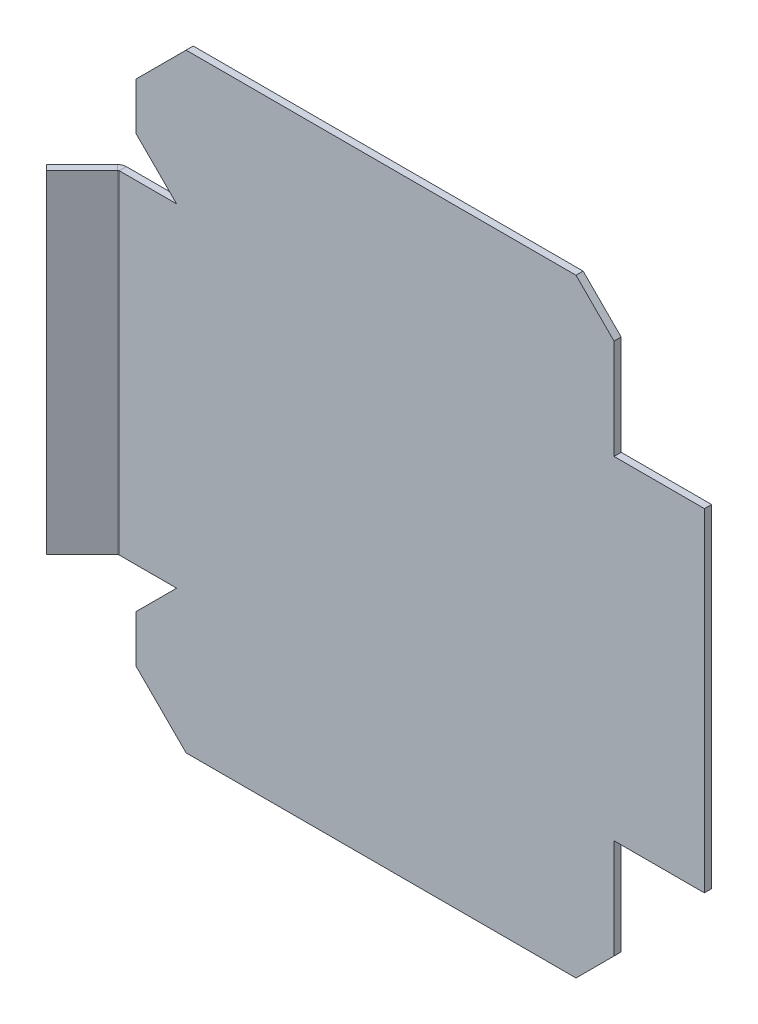
ISO-10303-21;
HEADER;
FILE_DESCRIPTION(('STEP AP214'),'2;1');
FILE_NAME('part.step','',(''),(''),'','','');
FILE_SCHEMA(('AUTOMOTIVE_DESIGN { 1 0 10303 214 1 1 1 1 }'));
ENDSEC;
DATA;
#1=APPLICATION_CONTEXT('core data for automotive mechanical design processes');
#2=APPLICATION_PROTOCOL_DEFINITION('international standard','automotive_design',2000,#1);
#3=PRODUCT_CONTEXT('',#1,'mechanical');
#4=PRODUCT('Part','Part','',(#3));
#5=PRODUCT_RELATED_PRODUCT_CATEGORY('part','',(#4));
#6=PRODUCT_DEFINITION_FORMATION('','',#4);
#7=PRODUCT_DEFINITION_CONTEXT('part definition',#1,'design');
#8=PRODUCT_DEFINITION('design','',#6,#7);
#9=PRODUCT_DEFINITION_SHAPE('','',#8);
#10=(LENGTH_UNIT() NAMED_UNIT(*) SI_UNIT(.MILLI.,.METRE.));
#11=(NAMED_UNIT(*) PLANE_ANGLE_UNIT() SI_UNIT($,.RADIAN.));
#12=(NAMED_UNIT(*) SI_UNIT($,.STERADIAN.) SOLID_ANGLE_UNIT());
#13=UNCERTAINTY_MEASURE_WITH_UNIT(LENGTH_MEASURE(1.E-05),#10,'distance_accuracy_value','');
#14=(GEOMETRIC_REPRESENTATION_CONTEXT(3) GLOBAL_UNCERTAINTY_ASSIGNED_CONTEXT((#13)) GLOBAL_UNIT_ASSIGNED_CONTEXT((#10,
#11,#12)) REPRESENTATION_CONTEXT('',''));
#15=CARTESIAN_POINT('',(0.,0.,0.));
#16=DIRECTION('',(0.,0.,1.));
#17=DIRECTION('',(1.,0.,0.));
#18=AXIS2_PLACEMENT_3D('',#15,#16,#17);
#19=CARTESIAN_POINT('',(38.5348645959272,0.,-20.2043042269632));
#20=DIRECTION('',(0.,-1.,0.));
#21=DIRECTION('',(0.707106781186546,0.,-0.707106781186549));
#22=AXIS2_PLACEMENT_3D('',#19,#20,#21);
#23=PLANE('',#22);
#24=DIRECTION('',(0.707106781186546,0.,-0.707106781186549));
#25=VECTOR('',#24,1.);
#26=CARTESIAN_POINT('',(38.5348645959272,0.,-20.2043042269632));
#27=LINE('',#26,#25);
#28=CARTESIAN_POINT('',(5.30084588015951,0.,13.0297144888046));
#29=VERTEX_POINT('',#28);
#30=CARTESIAN_POINT('',(20.2361355675457,0.,-1.90557519858165));
#31=VERTEX_POINT('',#30);
#32=EDGE_CURVE('E101',#29,#31,#27,.T.);
#33=ORIENTED_EDGE('',*,*,#32,.T.);
#34=DIRECTION('',(0.707106781186549,0.,0.707106781186546));
#35=VECTOR('',#34,1.);
#36=CARTESIAN_POINT('',(20.2361355675457,0.,-1.90557519858165));
#37=LINE('',#36,#35);
#38=CARTESIAN_POINT('',(22.3574559111054,0.,0.215745144977991));
#39=VERTEX_POINT('',#38);
#40=EDGE_CURVE('E12',#31,#39,#37,.T.);
#41=ORIENTED_EDGE('',*,*,#40,.T.);
#42=DIRECTION('',(0.707106781186546,0.,-0.707106781186549));
#43=VECTOR('',#42,1.);
#44=CARTESIAN_POINT('',(40.6561849394868,0.,-18.0829838834035));
#45=LINE('',#44,#43);
#46=CARTESIAN_POINT('',(7.42216622371916,0.,15.1510348323643));
#47=VERTEX_POINT('',#46);
#48=EDGE_CURVE('E91',#47,#39,#45,.T.);
#49=ORIENTED_EDGE('',*,*,#48,.F.);
#50=DIRECTION('',(0.707106781186549,0.,0.707106781186546));
#51=VECTOR('',#50,1.);
#52=CARTESIAN_POINT('',(5.30084588015951,0.,13.0297144888046));
#53=LINE('',#52,#51);
#54=EDGE_CURVE('E68',#29,#47,#53,.T.);
#55=ORIENTED_EDGE('',*,*,#54,.F.);
#56=EDGE_LOOP('',(#33,#41,#49,#55));
#57=FACE_BOUND('',#56,.T.);
#58=ADVANCED_FACE('F43',(#57),#23,.T.);
#59=CARTESIAN_POINT('',(5.3008458801595,140.,13.0297144888046));
#60=DIRECTION('',(0.,1.,0.));
#61=DIRECTION('',(0.707106781186549,0.,0.707106781186546));
#62=AXIS2_PLACEMENT_3D('',#59,#60,#61);
#63=PLANE('',#62);
#64=DIRECTION('',(-0.707106781186546,0.,0.707106781186549));
#65=VECTOR('',#64,1.);
#66=CARTESIAN_POINT('',(7.42216622371915,140.,15.1510348323642));
#67=LINE('',#66,#65);
#68=CARTESIAN_POINT('',(22.3574559111054,140.,0.215745144977991));
#69=VERTEX_POINT('',#68);
#70=CARTESIAN_POINT('',(7.42216622371915,140.,15.1510348323642));
#71=VERTEX_POINT('',#70);
#72=EDGE_CURVE('E95',#69,#71,#67,.T.);
#73=ORIENTED_EDGE('',*,*,#72,.F.);
#74=DIRECTION('',(-0.707106781186549,0.,-0.707106781186546));
#75=VECTOR('',#74,1.);
#76=CARTESIAN_POINT('',(20.2361355675457,140.,-1.90557519858165));
#77=LINE('',#76,#75);
#78=CARTESIAN_POINT('',(20.2361355675457,140.,-1.90557519858164));
#79=VERTEX_POINT('',#78);
#80=EDGE_CURVE('E110',#69,#79,#77,.T.);
#81=ORIENTED_EDGE('',*,*,#80,.T.);
#82=DIRECTION('',(-0.707106781186546,0.,0.707106781186549));
#83=VECTOR('',#82,1.);
#84=CARTESIAN_POINT('',(5.3008458801595,140.,13.0297144888046));
#85=LINE('',#84,#83);
#86=CARTESIAN_POINT('',(5.3008458801595,140.,13.0297144888046));
#87=VERTEX_POINT('',#86);
#88=EDGE_CURVE('E46',#79,#87,#85,.T.);
#89=ORIENTED_EDGE('',*,*,#88,.T.);
#90=DIRECTION('',(0.707106781186549,0.,0.707106781186546));
#91=VECTOR('',#90,1.);
#92=CARTESIAN_POINT('',(5.3008458801595,140.,13.0297144888046));
#93=LINE('',#92,#91);
#94=EDGE_CURVE('E88',#87,#71,#93,.T.);
#95=ORIENTED_EDGE('',*,*,#94,.T.);
#96=EDGE_LOOP('',(#73,#81,#89,#95));
#97=FACE_BOUND('',#96,.T.);
#98=ADVANCED_FACE('F405',(#97),#63,.T.);
#99=CARTESIAN_POINT('',(5.30084588015951,0.,13.0297144888046));
#100=DIRECTION('',(-0.707106781186549,0.,-0.707106781186546));
#101=DIRECTION('',(-0.707106781186546,0.,0.707106781186549));
#102=AXIS2_PLACEMENT_3D('',#99,#100,#101);
#103=PLANE('',#102);
#104=ORIENTED_EDGE('',*,*,#88,.F.);
#105=DIRECTION('',(0.,-1.,0.));
#106=VECTOR('',#105,1.);
#107=CARTESIAN_POINT('',(20.2361355675457,0.,-1.90557519858165));
#108=LINE('',#107,#106);
#109=EDGE_CURVE('E87',#79,#31,#108,.T.);
#110=ORIENTED_EDGE('',*,*,#109,.T.);
#111=ORIENTED_EDGE('',*,*,#32,.F.);
#112=DIRECTION('',(0.,-1.,0.));
#113=VECTOR('',#112,1.);
#114=CARTESIAN_POINT('',(5.30084588015951,0.,13.0297144888046));
#115=LINE('',#114,#113);
#116=EDGE_CURVE('E86',#87,#29,#115,.T.);
#117=ORIENTED_EDGE('',*,*,#116,.F.);
#118=EDGE_LOOP('',(#104,#110,#111,#117));
#119=FACE_BOUND('',#118,.T.);
#120=ADVANCED_FACE('F403',(#119),#103,.T.);
#121=CARTESIAN_POINT('',(5.30084588015951,0.,13.0297144888046));
#122=DIRECTION('',(-0.707106781186546,0.,0.707106781186549));
#123=DIRECTION('',(0.707106781186549,0.,0.707106781186546));
#124=AXIS2_PLACEMENT_3D('',#121,#122,#123);
#125=PLANE('',#124);
#126=DIRECTION('',(0.,-1.,0.));
#127=VECTOR('',#126,1.);
#128=CARTESIAN_POINT('',(7.42216622371916,0.,15.1510348323643));
#129=LINE('',#128,#127);
#130=EDGE_CURVE('E84',#71,#47,#129,.T.);
#131=ORIENTED_EDGE('',*,*,#130,.F.);
#132=ORIENTED_EDGE('',*,*,#94,.F.);
#133=ORIENTED_EDGE('',*,*,#116,.T.);
#134=ORIENTED_EDGE('',*,*,#54,.T.);
#135=EDGE_LOOP('',(#131,#132,#133,#134));
#136=FACE_BOUND('',#135,.T.);
#137=ADVANCED_FACE('F81',(#136),#125,.T.);
#138=CARTESIAN_POINT('',(7.42216622371916,0.,15.1510348323643));
#139=DIRECTION('',(-0.707106781186549,0.,-0.707106781186546));
#140=DIRECTION('',(-0.707106781186546,0.,0.707106781186549));
#141=AXIS2_PLACEMENT_3D('',#138,#139,#140);
#142=PLANE('',#141);
#143=DIRECTION('',(0.,-1.,0.));
#144=VECTOR('',#143,1.);
#145=CARTESIAN_POINT('',(22.3574559111054,0.,0.215745144977991));
#146=LINE('',#145,#144);
#147=EDGE_CURVE('E51',#69,#39,#146,.T.);
#148=ORIENTED_EDGE('',*,*,#147,.F.);
#149=ORIENTED_EDGE('',*,*,#72,.T.);
#150=ORIENTED_EDGE('',*,*,#130,.T.);
#151=ORIENTED_EDGE('',*,*,#48,.T.);
#152=EDGE_LOOP('',(#148,#149,#150,#151));
#153=FACE_BOUND('',#152,.T.);
#154=ADVANCED_FACE('F98',(#153),#142,.F.);
#155=CARTESIAN_POINT('',(30.0000000000008,-16.9999999999991,-3.));
#156=DIRECTION('',(-0.707106781186546,0.707106781186549,0.));
#157=DIRECTION('',(-0.707106781186549,-0.707106781186546,0.));
#158=AXIS2_PLACEMENT_3D('',#155,#156,#157);
#159=PLANE('',#158);
#160=DIRECTION('',(-0.707106781186549,-0.707106781186546,0.));
#161=VECTOR('',#160,1.);
#162=CARTESIAN_POINT('',(30.0000000000008,-16.9999999999991,0.));
#163=LINE('',#162,#161);
#164=CARTESIAN_POINT('',(47.,0.,0.));
#165=VERTEX_POINT('',#164);
#166=CARTESIAN_POINT('',(30.0000000000008,-16.9999999999991,0.));
#167=VERTEX_POINT('',#166);
#168=EDGE_CURVE('E185',#165,#167,#163,.T.);
#169=ORIENTED_EDGE('',*,*,#168,.F.);
#170=DIRECTION('',(0.,0.,1.));
#171=VECTOR('',#170,1.);
#172=CARTESIAN_POINT('',(47.,0.,-3.));
#173=LINE('',#172,#171);
#174=CARTESIAN_POINT('',(47.,0.,-3.));
#175=VERTEX_POINT('',#174);
#176=EDGE_CURVE('E96',#175,#165,#173,.T.);
#177=ORIENTED_EDGE('',*,*,#176,.F.);
#178=DIRECTION('',(-0.707106781186549,-0.707106781186546,0.));
#179=VECTOR('',#178,1.);
#180=CARTESIAN_POINT('',(30.0000000000008,-16.9999999999991,-3.));
#181=LINE('',#180,#179);
#182=CARTESIAN_POINT('',(30.0000000000008,-16.9999999999991,-3.));
#183=VERTEX_POINT('',#182);
#184=EDGE_CURVE('E287',#175,#183,#181,.T.);
#185=ORIENTED_EDGE('',*,*,#184,.T.);
#186=DIRECTION('',(0.,0.,1.));
#187=VECTOR('',#186,1.);
#188=CARTESIAN_POINT('',(30.0000000000008,-16.9999999999991,-3.));
#189=LINE('',#188,#187);
#190=EDGE_CURVE('E284',#183,#167,#189,.T.);
#191=ORIENTED_EDGE('',*,*,#190,.T.);
#192=EDGE_LOOP('',(#169,#177,#185,#191));
#193=FACE_BOUND('',#192,.T.);
#194=ADVANCED_FACE('F415',(#193),#159,.T.);
#195=CARTESIAN_POINT('',(30.0000000000008,-36.9999999999991,-3.));
#196=DIRECTION('',(-1.,0.,0.));
#197=DIRECTION('',(0.,-1.,0.));
#198=AXIS2_PLACEMENT_3D('',#195,#196,#197);
#199=PLANE('',#198);
#200=DIRECTION('',(0.,-1.,0.));
#201=VECTOR('',#200,1.);
#202=CARTESIAN_POINT('',(30.0000000000008,-36.9999999999991,0.));
#203=LINE('',#202,#201);
#204=CARTESIAN_POINT('',(30.0000000000008,-36.9999999999991,0.));
#205=VERTEX_POINT('',#204);
#206=EDGE_CURVE('E182',#167,#205,#203,.T.);
#207=ORIENTED_EDGE('',*,*,#206,.F.);
#208=ORIENTED_EDGE('',*,*,#190,.F.);
#209=DIRECTION('',(0.,-1.,0.));
#210=VECTOR('',#209,1.);
#211=CARTESIAN_POINT('',(30.0000000000008,-36.9999999999991,-3.));
#212=LINE('',#211,#210);
#213=CARTESIAN_POINT('',(30.0000000000008,-36.9999999999991,-3.));
#214=VERTEX_POINT('',#213);
#215=EDGE_CURVE('E281',#183,#214,#212,.T.);
#216=ORIENTED_EDGE('',*,*,#215,.T.);
#217=DIRECTION('',(0.,0.,1.));
#218=VECTOR('',#217,1.);
#219=CARTESIAN_POINT('',(30.0000000000008,-36.9999999999991,-3.));
#220=LINE('',#219,#218);
#221=EDGE_CURVE('E278',#214,#205,#220,.T.);
#222=ORIENTED_EDGE('',*,*,#221,.T.);
#223=EDGE_LOOP('',(#207,#208,#216,#222));
#224=FACE_BOUND('',#223,.T.);
#225=ADVANCED_FACE('F420',(#224),#199,.T.);
#226=CARTESIAN_POINT('',(51.0000000000019,-58.,-3.));
#227=DIRECTION('',(-0.707106781186545,-0.70710678118655,0.));
#228=DIRECTION('',(0.70710678118655,-0.707106781186545,0.));
#229=AXIS2_PLACEMENT_3D('',#226,#227,#228);
#230=PLANE('',#229);
#231=DIRECTION('',(0.70710678118655,-0.707106781186545,0.));
#232=VECTOR('',#231,1.);
#233=CARTESIAN_POINT('',(51.0000000000019,-58.,0.));
#234=LINE('',#233,#232);
#235=CARTESIAN_POINT('',(51.0000000000019,-58.,0.));
#236=VERTEX_POINT('',#235);
#237=EDGE_CURVE('E179',#205,#236,#234,.T.);
#238=ORIENTED_EDGE('',*,*,#237,.F.);
#239=ORIENTED_EDGE('',*,*,#221,.F.);
#240=DIRECTION('',(0.70710678118655,-0.707106781186545,0.));
#241=VECTOR('',#240,1.);
#242=CARTESIAN_POINT('',(51.0000000000019,-58.,-3.));
#243=LINE('',#242,#241);
#244=CARTESIAN_POINT('',(51.0000000000019,-58.,-3.));
#245=VERTEX_POINT('',#244);
#246=EDGE_CURVE('E275',#214,#245,#243,.T.);
#247=ORIENTED_EDGE('',*,*,#246,.T.);
#248=DIRECTION('',(0.,0.,1.));
#249=VECTOR('',#248,1.);
#250=CARTESIAN_POINT('',(51.0000000000019,-58.,-3.));
#251=LINE('',#250,#249);
#252=EDGE_CURVE('E272',#245,#236,#251,.T.);
#253=ORIENTED_EDGE('',*,*,#252,.T.);
#254=EDGE_LOOP('',(#238,#239,#247,#253));
#255=FACE_BOUND('',#254,.T.);
#256=ADVANCED_FACE('F482',(#255),#230,.T.);
#257=CARTESIAN_POINT('',(215.000000000001,-58.,-3.));
#258=DIRECTION('',(0.,-1.,0.));
#259=DIRECTION('',(1.,0.,0.));
#260=AXIS2_PLACEMENT_3D('',#257,#258,#259);
#261=PLANE('',#260);
#262=DIRECTION('',(1.,0.,0.));
#263=VECTOR('',#262,1.);
#264=CARTESIAN_POINT('',(215.000000000001,-58.,0.));
#265=LINE('',#264,#263);
#266=CARTESIAN_POINT('',(215.000000000001,-58.,0.));
#267=VERTEX_POINT('',#266);
#268=EDGE_CURVE('E176',#236,#267,#265,.T.);
#269=ORIENTED_EDGE('',*,*,#268,.F.);
#270=ORIENTED_EDGE('',*,*,#252,.F.);
#271=DIRECTION('',(1.,0.,0.));
#272=VECTOR('',#271,1.);
#273=CARTESIAN_POINT('',(215.000000000001,-58.,-3.));
#274=LINE('',#273,#272);
#275=CARTESIAN_POINT('',(215.000000000001,-58.,-3.));
#276=VERTEX_POINT('',#275);
#277=EDGE_CURVE('E269',#245,#276,#274,.T.);
#278=ORIENTED_EDGE('',*,*,#277,.T.);
#279=DIRECTION('',(0.,0.,1.));
#280=VECTOR('',#279,1.);
#281=CARTESIAN_POINT('',(215.000000000001,-58.,-3.));
#282=LINE('',#281,#280);
#283=EDGE_CURVE('E266',#276,#267,#282,.T.);
#284=ORIENTED_EDGE('',*,*,#283,.T.);
#285=EDGE_LOOP('',(#269,#270,#278,#284));
#286=FACE_BOUND('',#285,.T.);
#287=ADVANCED_FACE('F478',(#286),#261,.T.);
#288=CARTESIAN_POINT('',(231.000000000001,-42.,-3.));
#289=DIRECTION('',(0.707106781186542,-0.707106781186553,0.));
#290=DIRECTION('',(0.707106781186553,0.707106781186542,0.));
#291=AXIS2_PLACEMENT_3D('',#288,#289,#290);
#292=PLANE('',#291);
#293=DIRECTION('',(0.707106781186553,0.707106781186542,0.));
#294=VECTOR('',#293,1.);
#295=CARTESIAN_POINT('',(231.000000000001,-42.,0.));
#296=LINE('',#295,#294);
#297=CARTESIAN_POINT('',(231.000000000001,-42.,0.));
#298=VERTEX_POINT('',#297);
#299=EDGE_CURVE('E173',#267,#298,#296,.T.);
#300=ORIENTED_EDGE('',*,*,#299,.F.);
#301=ORIENTED_EDGE('',*,*,#283,.F.);
#302=DIRECTION('',(0.707106781186553,0.707106781186542,0.));
#303=VECTOR('',#302,1.);
#304=CARTESIAN_POINT('',(231.000000000001,-42.,-3.));
#305=LINE('',#304,#303);
#306=CARTESIAN_POINT('',(231.000000000001,-42.,-3.));
#307=VERTEX_POINT('',#306);
#308=EDGE_CURVE('E263',#276,#307,#305,.T.);
#309=ORIENTED_EDGE('',*,*,#308,.T.);
#310=DIRECTION('',(0.,0.,1.));
#311=VECTOR('',#310,1.);
#312=CARTESIAN_POINT('',(231.000000000001,-42.,-3.));
#313=LINE('',#312,#311);
#314=EDGE_CURVE('E260',#307,#298,#313,.T.);
#315=ORIENTED_EDGE('',*,*,#314,.T.);
#316=EDGE_LOOP('',(#300,#301,#309,#315));
#317=FACE_BOUND('',#316,.T.);
#318=ADVANCED_FACE('F474',(#317),#292,.T.);
#319=CARTESIAN_POINT('',(231.000000000001,0.,-3.));
#320=DIRECTION('',(1.,0.,0.));
#321=DIRECTION('',(0.,0.,-1.));
#322=AXIS2_PLACEMENT_3D('',#319,#320,#321);
#323=PLANE('',#322);
#324=DIRECTION('',(0.,1.,0.));
#325=VECTOR('',#324,1.);
#326=CARTESIAN_POINT('',(231.000000000001,0.,0.));
#327=LINE('',#326,#325);
#328=CARTESIAN_POINT('',(231.000000000001,0.,0.));
#329=VERTEX_POINT('',#328);
#330=EDGE_CURVE('E170',#298,#329,#327,.T.);
#331=ORIENTED_EDGE('',*,*,#330,.F.);
#332=ORIENTED_EDGE('',*,*,#314,.F.);
#333=DIRECTION('',(0.,1.,0.));
#334=VECTOR('',#333,1.);
#335=CARTESIAN_POINT('',(231.000000000001,0.,-3.));
#336=LINE('',#335,#334);
#337=CARTESIAN_POINT('',(231.000000000001,0.,-3.));
#338=VERTEX_POINT('',#337);
#339=EDGE_CURVE('E257',#307,#338,#336,.T.);
#340=ORIENTED_EDGE('',*,*,#339,.T.);
#341=DIRECTION('',(0.,0.,1.));
#342=VECTOR('',#341,1.);
#343=CARTESIAN_POINT('',(231.000000000001,0.,-3.));
#344=LINE('',#343,#342);
#345=EDGE_CURVE('E254',#338,#329,#344,.T.);
#346=ORIENTED_EDGE('',*,*,#345,.T.);
#347=EDGE_LOOP('',(#331,#332,#340,#346));
#348=FACE_BOUND('',#347,.T.);
#349=ADVANCED_FACE('F470',(#348),#323,.T.);
#350=CARTESIAN_POINT('',(269.000000000001,0.,-3.));
#351=DIRECTION('',(0.,-1.,0.));
#352=DIRECTION('',(1.,0.,0.));
#353=AXIS2_PLACEMENT_3D('',#350,#351,#352);
#354=PLANE('',#353);
#355=DIRECTION('',(1.,0.,0.));
#356=VECTOR('',#355,1.);
#357=CARTESIAN_POINT('',(269.000000000001,0.,0.));
#358=LINE('',#357,#356);
#359=CARTESIAN_POINT('',(269.000000000001,0.,0.));
#360=VERTEX_POINT('',#359);
#361=EDGE_CURVE('E167',#329,#360,#358,.T.);
#362=ORIENTED_EDGE('',*,*,#361,.F.);
#363=ORIENTED_EDGE('',*,*,#345,.F.);
#364=DIRECTION('',(1.,0.,0.));
#365=VECTOR('',#364,1.);
#366=CARTESIAN_POINT('',(269.000000000001,0.,-3.));
#367=LINE('',#366,#365);
#368=CARTESIAN_POINT('',(269.000000000001,0.,-3.));
#369=VERTEX_POINT('',#368);
#370=EDGE_CURVE('E251',#338,#369,#367,.T.);
#371=ORIENTED_EDGE('',*,*,#370,.T.);
#372=DIRECTION('',(0.,0.,1.));
#373=VECTOR('',#372,1.);
#374=CARTESIAN_POINT('',(269.000000000001,0.,-3.));
#375=LINE('',#374,#373);
#376=EDGE_CURVE('E248',#369,#360,#375,.T.);
#377=ORIENTED_EDGE('',*,*,#376,.T.);
#378=EDGE_LOOP('',(#362,#363,#371,#377));
#379=FACE_BOUND('',#378,.T.);
#380=ADVANCED_FACE('F466',(#379),#354,.T.);
#381=CARTESIAN_POINT('',(269.000000000001,140.,-3.));
#382=DIRECTION('',(1.,0.,0.));
#383=DIRECTION('',(0.,0.,-1.));
#384=AXIS2_PLACEMENT_3D('',#381,#382,#383);
#385=PLANE('',#384);
#386=DIRECTION('',(0.,1.,0.));
#387=VECTOR('',#386,1.);
#388=CARTESIAN_POINT('',(269.000000000001,140.,0.));
#389=LINE('',#388,#387);
#390=CARTESIAN_POINT('',(269.000000000001,140.,0.));
#391=VERTEX_POINT('',#390);
#392=EDGE_CURVE('E164',#360,#391,#389,.T.);
#393=ORIENTED_EDGE('',*,*,#392,.F.);
#394=ORIENTED_EDGE('',*,*,#376,.F.);
#395=DIRECTION('',(0.,1.,0.));
#396=VECTOR('',#395,1.);
#397=CARTESIAN_POINT('',(269.000000000001,140.,-3.));
#398=LINE('',#397,#396);
#399=CARTESIAN_POINT('',(269.000000000001,140.,-3.));
#400=VERTEX_POINT('',#399);
#401=EDGE_CURVE('E245',#369,#400,#398,.T.);
#402=ORIENTED_EDGE('',*,*,#401,.T.);
#403=DIRECTION('',(0.,0.,1.));
#404=VECTOR('',#403,1.);
#405=CARTESIAN_POINT('',(269.000000000001,140.,-3.));
#406=LINE('',#405,#404);
#407=EDGE_CURVE('E242',#400,#391,#406,.T.);
#408=ORIENTED_EDGE('',*,*,#407,.T.);
#409=EDGE_LOOP('',(#393,#394,#402,#408));
#410=FACE_BOUND('',#409,.T.);
#411=ADVANCED_FACE('F462',(#410),#385,.T.);
#412=CARTESIAN_POINT('',(231.000000000001,140.,-3.));
#413=DIRECTION('',(0.,1.,0.));
#414=DIRECTION('',(-1.,0.,0.));
#415=AXIS2_PLACEMENT_3D('',#412,#413,#414);
#416=PLANE('',#415);
#417=DIRECTION('',(-1.,0.,0.));
#418=VECTOR('',#417,1.);
#419=CARTESIAN_POINT('',(231.000000000001,140.,0.));
#420=LINE('',#419,#418);
#421=CARTESIAN_POINT('',(231.000000000001,140.,0.));
#422=VERTEX_POINT('',#421);
#423=EDGE_CURVE('E161',#391,#422,#420,.T.);
#424=ORIENTED_EDGE('',*,*,#423,.F.);
#425=ORIENTED_EDGE('',*,*,#407,.F.);
#426=DIRECTION('',(-1.,0.,0.));
#427=VECTOR('',#426,1.);
#428=CARTESIAN_POINT('',(231.000000000001,140.,-3.));
#429=LINE('',#428,#427);
#430=CARTESIAN_POINT('',(231.000000000001,140.,-3.));
#431=VERTEX_POINT('',#430);
#432=EDGE_CURVE('E239',#400,#431,#429,.T.);
#433=ORIENTED_EDGE('',*,*,#432,.T.);
#434=DIRECTION('',(0.,0.,1.));
#435=VECTOR('',#434,1.);
#436=CARTESIAN_POINT('',(231.000000000001,140.,-3.));
#437=LINE('',#436,#435);
#438=EDGE_CURVE('E236',#431,#422,#437,.T.);
#439=ORIENTED_EDGE('',*,*,#438,.T.);
#440=EDGE_LOOP('',(#424,#425,#433,#439));
#441=FACE_BOUND('',#440,.T.);
#442=ADVANCED_FACE('F458',(#441),#416,.T.);
#443=CARTESIAN_POINT('',(231.000000000001,182.,-3.));
#444=DIRECTION('',(1.,0.,0.));
#445=DIRECTION('',(0.,0.,-1.));
#446=AXIS2_PLACEMENT_3D('',#443,#444,#445);
#447=PLANE('',#446);
#448=DIRECTION('',(0.,1.,0.));
#449=VECTOR('',#448,1.);
#450=CARTESIAN_POINT('',(231.000000000001,182.,0.));
#451=LINE('',#450,#449);
#452=CARTESIAN_POINT('',(231.000000000001,182.,0.));
#453=VERTEX_POINT('',#452);
#454=EDGE_CURVE('E158',#422,#453,#451,.T.);
#455=ORIENTED_EDGE('',*,*,#454,.F.);
#456=ORIENTED_EDGE('',*,*,#438,.F.);
#457=DIRECTION('',(0.,1.,0.));
#458=VECTOR('',#457,1.);
#459=CARTESIAN_POINT('',(231.000000000001,182.,-3.));
#460=LINE('',#459,#458);
#461=CARTESIAN_POINT('',(231.000000000001,182.,-3.));
#462=VERTEX_POINT('',#461);
#463=EDGE_CURVE('E233',#431,#462,#460,.T.);
#464=ORIENTED_EDGE('',*,*,#463,.T.);
#465=DIRECTION('',(0.,0.,1.));
#466=VECTOR('',#465,1.);
#467=CARTESIAN_POINT('',(231.000000000001,182.,-3.));
#468=LINE('',#467,#466);
#469=EDGE_CURVE('E230',#462,#453,#468,.T.);
#470=ORIENTED_EDGE('',*,*,#469,.T.);
#471=EDGE_LOOP('',(#455,#456,#464,#470));
#472=FACE_BOUND('',#471,.T.);
#473=ADVANCED_FACE('F454',(#472),#447,.T.);
#474=CARTESIAN_POINT('',(215.000000000002,197.999999999999,-3.));
#475=DIRECTION('',(0.707106781186552,0.707106781186543,0.));
#476=DIRECTION('',(-0.707106781186543,0.707106781186552,0.));
#477=AXIS2_PLACEMENT_3D('',#474,#475,#476);
#478=PLANE('',#477);
#479=DIRECTION('',(-0.707106781186543,0.707106781186552,0.));
#480=VECTOR('',#479,1.);
#481=CARTESIAN_POINT('',(215.000000000002,197.999999999999,0.));
#482=LINE('',#481,#480);
#483=CARTESIAN_POINT('',(215.000000000002,197.999999999999,0.));
#484=VERTEX_POINT('',#483);
#485=EDGE_CURVE('E155',#453,#484,#482,.T.);
#486=ORIENTED_EDGE('',*,*,#485,.F.);
#487=ORIENTED_EDGE('',*,*,#469,.F.);
#488=DIRECTION('',(-0.707106781186543,0.707106781186552,0.));
#489=VECTOR('',#488,1.);
#490=CARTESIAN_POINT('',(215.000000000002,197.999999999999,-3.));
#491=LINE('',#490,#489);
#492=CARTESIAN_POINT('',(215.000000000002,197.999999999999,-3.));
#493=VERTEX_POINT('',#492);
#494=EDGE_CURVE('E227',#462,#493,#491,.T.);
#495=ORIENTED_EDGE('',*,*,#494,.T.);
#496=DIRECTION('',(0.,0.,1.));
#497=VECTOR('',#496,1.);
#498=CARTESIAN_POINT('',(215.000000000002,197.999999999999,-3.));
#499=LINE('',#498,#497);
#500=EDGE_CURVE('E224',#493,#484,#499,.T.);
#501=ORIENTED_EDGE('',*,*,#500,.T.);
#502=EDGE_LOOP('',(#486,#487,#495,#501));
#503=FACE_BOUND('',#502,.T.);
#504=ADVANCED_FACE('F450',(#503),#478,.T.);
#505=CARTESIAN_POINT('',(51.000000000002,198.,-3.));
#506=DIRECTION('',(0.,1.,0.));
#507=DIRECTION('',(-1.,0.,0.));
#508=AXIS2_PLACEMENT_3D('',#505,#506,#507);
#509=PLANE('',#508);
#510=DIRECTION('',(-1.,0.,0.));
#511=VECTOR('',#510,1.);
#512=CARTESIAN_POINT('',(51.000000000002,198.,0.));
#513=LINE('',#512,#511);
#514=CARTESIAN_POINT('',(51.000000000002,198.,0.));
#515=VERTEX_POINT('',#514);
#516=EDGE_CURVE('E152',#484,#515,#513,.T.);
#517=ORIENTED_EDGE('',*,*,#516,.F.);
#518=ORIENTED_EDGE('',*,*,#500,.F.);
#519=DIRECTION('',(-1.,0.,0.));
#520=VECTOR('',#519,1.);
#521=CARTESIAN_POINT('',(51.000000000002,198.,-3.));
#522=LINE('',#521,#520);
#523=CARTESIAN_POINT('',(51.000000000002,198.,-3.));
#524=VERTEX_POINT('',#523);
#525=EDGE_CURVE('E221',#493,#524,#522,.T.);
#526=ORIENTED_EDGE('',*,*,#525,.T.);
#527=DIRECTION('',(0.,0.,1.));
#528=VECTOR('',#527,1.);
#529=CARTESIAN_POINT('',(51.000000000002,198.,-3.));
#530=LINE('',#529,#528);
#531=EDGE_CURVE('E218',#524,#515,#530,.T.);
#532=ORIENTED_EDGE('',*,*,#531,.T.);
#533=EDGE_LOOP('',(#517,#518,#526,#532));
#534=FACE_BOUND('',#533,.T.);
#535=ADVANCED_FACE('F446',(#534),#509,.T.);
#536=CARTESIAN_POINT('',(30.0000000000009,176.999999999999,-3.));
#537=DIRECTION('',(-0.707106781186544,0.707106781186551,0.));
#538=DIRECTION('',(-0.707106781186551,-0.707106781186544,0.));
#539=AXIS2_PLACEMENT_3D('',#536,#537,#538);
#540=PLANE('',#539);
#541=DIRECTION('',(-0.707106781186551,-0.707106781186544,0.));
#542=VECTOR('',#541,1.);
#543=CARTESIAN_POINT('',(30.0000000000009,176.999999999999,0.));
#544=LINE('',#543,#542);
#545=CARTESIAN_POINT('',(30.0000000000009,176.999999999999,0.));
#546=VERTEX_POINT('',#545);
#547=EDGE_CURVE('E149',#515,#546,#544,.T.);
#548=ORIENTED_EDGE('',*,*,#547,.F.);
#549=ORIENTED_EDGE('',*,*,#531,.F.);
#550=DIRECTION('',(-0.707106781186551,-0.707106781186544,0.));
#551=VECTOR('',#550,1.);
#552=CARTESIAN_POINT('',(30.0000000000009,176.999999999999,-3.));
#553=LINE('',#552,#551);
#554=CARTESIAN_POINT('',(30.0000000000009,176.999999999999,-3.));
#555=VERTEX_POINT('',#554);
#556=EDGE_CURVE('E215',#524,#555,#553,.T.);
#557=ORIENTED_EDGE('',*,*,#556,.T.);
#558=DIRECTION('',(0.,0.,1.));
#559=VECTOR('',#558,1.);
#560=CARTESIAN_POINT('',(30.0000000000009,176.999999999999,-3.));
#561=LINE('',#560,#559);
#562=EDGE_CURVE('E212',#555,#546,#561,.T.);
#563=ORIENTED_EDGE('',*,*,#562,.T.);
#564=EDGE_LOOP('',(#548,#549,#557,#563));
#565=FACE_BOUND('',#564,.T.);
#566=ADVANCED_FACE('F442',(#565),#540,.T.);
#567=CARTESIAN_POINT('',(30.0000000000009,156.999999999999,-3.));
#568=DIRECTION('',(-1.,0.,0.));
#569=DIRECTION('',(0.,0.,1.));
#570=AXIS2_PLACEMENT_3D('',#567,#568,#569);
#571=PLANE('',#570);
#572=DIRECTION('',(0.,-1.,0.));
#573=VECTOR('',#572,1.);
#574=CARTESIAN_POINT('',(30.0000000000009,156.999999999999,0.));
#575=LINE('',#574,#573);
#576=CARTESIAN_POINT('',(30.0000000000009,156.999999999999,0.));
#577=VERTEX_POINT('',#576);
#578=EDGE_CURVE('E146',#546,#577,#575,.T.);
#579=ORIENTED_EDGE('',*,*,#578,.F.);
#580=ORIENTED_EDGE('',*,*,#562,.F.);
#581=DIRECTION('',(0.,-1.,0.));
#582=VECTOR('',#581,1.);
#583=CARTESIAN_POINT('',(30.0000000000009,156.999999999999,-3.));
#584=LINE('',#583,#582);
#585=CARTESIAN_POINT('',(30.0000000000009,156.999999999999,-3.));
#586=VERTEX_POINT('',#585);
#587=EDGE_CURVE('E209',#555,#586,#584,.T.);
#588=ORIENTED_EDGE('',*,*,#587,.T.);
#589=DIRECTION('',(0.,0.,1.));
#590=VECTOR('',#589,1.);
#591=CARTESIAN_POINT('',(30.0000000000009,156.999999999999,-3.));
#592=LINE('',#591,#590);
#593=EDGE_CURVE('E206',#586,#577,#592,.T.);
#594=ORIENTED_EDGE('',*,*,#593,.T.);
#595=EDGE_LOOP('',(#579,#580,#588,#594));
#596=FACE_BOUND('',#595,.T.);
#597=ADVANCED_FACE('F438',(#596),#571,.T.);
#598=CARTESIAN_POINT('',(47.,140.,-3.));
#599=DIRECTION('',(-0.707106781186545,-0.70710678118655,0.));
#600=DIRECTION('',(0.70710678118655,-0.707106781186545,0.));
#601=AXIS2_PLACEMENT_3D('',#598,#599,#600);
#602=PLANE('',#601);
#603=DIRECTION('',(0.70710678118655,-0.707106781186545,0.));
#604=VECTOR('',#603,1.);
#605=CARTESIAN_POINT('',(47.,140.,0.));
#606=LINE('',#605,#604);
#607=CARTESIAN_POINT('',(47.,140.,0.));
#608=VERTEX_POINT('',#607);
#609=EDGE_CURVE('E143',#577,#608,#606,.T.);
#610=ORIENTED_EDGE('',*,*,#609,.F.);
#611=ORIENTED_EDGE('',*,*,#593,.F.);
#612=DIRECTION('',(0.70710678118655,-0.707106781186545,0.));
#613=VECTOR('',#612,1.);
#614=CARTESIAN_POINT('',(47.,140.,-3.));
#615=LINE('',#614,#613);
#616=CARTESIAN_POINT('',(47.,140.,-3.));
#617=VERTEX_POINT('',#616);
#618=EDGE_CURVE('E203',#586,#617,#615,.T.);
#619=ORIENTED_EDGE('',*,*,#618,.T.);
#620=DIRECTION('',(0.,0.,1.));
#621=VECTOR('',#620,1.);
#622=CARTESIAN_POINT('',(47.,140.,-3.));
#623=LINE('',#622,#621);
#624=EDGE_CURVE('E200',#617,#608,#623,.T.);
#625=ORIENTED_EDGE('',*,*,#624,.T.);
#626=EDGE_LOOP('',(#610,#611,#619,#625));
#627=FACE_BOUND('',#626,.T.);
#628=ADVANCED_FACE('F435',(#627),#602,.T.);
#629=CARTESIAN_POINT('',(0.,0.,-3.));
#630=DIRECTION('',(0.,0.,-1.));
#631=DIRECTION('',(-1.,0.,0.));
#632=AXIS2_PLACEMENT_3D('',#629,#630,#631);
#633=PLANE('',#632);
#634=DIRECTION('',(0.,-1.,0.));
#635=VECTOR('',#634,1.);
#636=CARTESIAN_POINT('',(22.8783107661274,0.,-3.));
#637=LINE('',#636,#635);
#638=CARTESIAN_POINT('',(22.8783107661274,140.,-3.));
#639=VERTEX_POINT('',#638);
#640=CARTESIAN_POINT('',(22.8783107661274,0.,-3.));
#641=VERTEX_POINT('',#640);
#642=EDGE_CURVE('E293',#639,#641,#637,.T.);
#643=ORIENTED_EDGE('',*,*,#642,.F.);
#644=DIRECTION('',(-1.,0.,0.));
#645=VECTOR('',#644,1.);
#646=CARTESIAN_POINT('',(0.,140.,-3.));
#647=LINE('',#646,#645);
#648=EDGE_CURVE('E197',#617,#639,#647,.T.);
#649=ORIENTED_EDGE('',*,*,#648,.F.);
#650=ORIENTED_EDGE('',*,*,#618,.F.);
#651=ORIENTED_EDGE('',*,*,#587,.F.);
#652=ORIENTED_EDGE('',*,*,#556,.F.);
#653=ORIENTED_EDGE('',*,*,#525,.F.);
#654=ORIENTED_EDGE('',*,*,#494,.F.);
#655=ORIENTED_EDGE('',*,*,#463,.F.);
#656=ORIENTED_EDGE('',*,*,#432,.F.);
#657=ORIENTED_EDGE('',*,*,#401,.F.);
#658=ORIENTED_EDGE('',*,*,#370,.F.);
#659=ORIENTED_EDGE('',*,*,#339,.F.);
#660=ORIENTED_EDGE('',*,*,#308,.F.);
#661=ORIENTED_EDGE('',*,*,#277,.F.);
#662=ORIENTED_EDGE('',*,*,#246,.F.);
#663=ORIENTED_EDGE('',*,*,#215,.F.);
#664=ORIENTED_EDGE('',*,*,#184,.F.);
#665=DIRECTION('',(1.,0.,0.));
#666=VECTOR('',#665,1.);
#667=CARTESIAN_POINT('',(47.,0.,-3.));
#668=LINE('',#667,#666);
#669=EDGE_CURVE('E140',#641,#175,#668,.T.);
#670=ORIENTED_EDGE('',*,*,#669,.F.);
#671=EDGE_LOOP('',(#643,#649,#650,#651,#652,#653,#654,#655,#656,#657,#658,#659,#660,#661,#662,
#663,#664,#670));
#672=FACE_BOUND('',#671,.T.);
#673=ADVANCED_FACE('F302',(#672),#633,.T.);
#674=CARTESIAN_POINT('',(0.,140.,-3.));
#675=DIRECTION('',(0.,1.,0.));
#676=DIRECTION('',(0.,0.,1.));
#677=AXIS2_PLACEMENT_3D('',#674,#675,#676);
#678=PLANE('',#677);
#679=DIRECTION('',(0.,0.,-1.));
#680=VECTOR('',#679,1.);
#681=CARTESIAN_POINT('',(22.8783107661274,140.,-3.));
#682=LINE('',#681,#680);
#683=CARTESIAN_POINT('',(22.8783107661274,140.,0.));
#684=VERTEX_POINT('',#683);
#685=EDGE_CURVE('E290',#684,#639,#682,.T.);
#686=ORIENTED_EDGE('',*,*,#685,.F.);
#687=DIRECTION('',(-1.,0.,0.));
#688=VECTOR('',#687,1.);
#689=CARTESIAN_POINT('',(0.,140.,0.));
#690=LINE('',#689,#688);
#691=EDGE_CURVE('E194',#608,#684,#690,.T.);
#692=ORIENTED_EDGE('',*,*,#691,.F.);
#693=ORIENTED_EDGE('',*,*,#624,.F.);
#694=ORIENTED_EDGE('',*,*,#648,.T.);
#695=EDGE_LOOP('',(#686,#692,#693,#694));
#696=FACE_BOUND('',#695,.T.);
#697=ADVANCED_FACE('F316',(#696),#678,.T.);
#698=CARTESIAN_POINT('',(0.,0.,0.));
#699=DIRECTION('',(0.,0.,-1.));
#700=DIRECTION('',(-1.,0.,0.));
#701=AXIS2_PLACEMENT_3D('',#698,#699,#700);
#702=PLANE('',#701);
#703=ORIENTED_EDGE('',*,*,#691,.T.);
#704=DIRECTION('',(0.,-1.,0.));
#705=VECTOR('',#704,1.);
#706=CARTESIAN_POINT('',(22.8783107661274,0.,0.));
#707=LINE('',#706,#705);
#708=CARTESIAN_POINT('',(22.8783107661274,0.,0.));
#709=VERTEX_POINT('',#708);
#710=EDGE_CURVE('E191',#684,#709,#707,.T.);
#711=ORIENTED_EDGE('',*,*,#710,.T.);
#712=DIRECTION('',(1.,0.,0.));
#713=VECTOR('',#712,1.);
#714=CARTESIAN_POINT('',(47.,0.,0.));
#715=LINE('',#714,#713);
#716=EDGE_CURVE('E188',#709,#165,#715,.T.);
#717=ORIENTED_EDGE('',*,*,#716,.T.);
#718=ORIENTED_EDGE('',*,*,#168,.T.);
#719=ORIENTED_EDGE('',*,*,#206,.T.);
#720=ORIENTED_EDGE('',*,*,#237,.T.);
#721=ORIENTED_EDGE('',*,*,#268,.T.);
#722=ORIENTED_EDGE('',*,*,#299,.T.);
#723=ORIENTED_EDGE('',*,*,#330,.T.);
#724=ORIENTED_EDGE('',*,*,#361,.T.);
#725=ORIENTED_EDGE('',*,*,#392,.T.);
#726=ORIENTED_EDGE('',*,*,#423,.T.);
#727=ORIENTED_EDGE('',*,*,#454,.T.);
#728=ORIENTED_EDGE('',*,*,#485,.T.);
#729=ORIENTED_EDGE('',*,*,#516,.T.);
#730=ORIENTED_EDGE('',*,*,#547,.T.);
#731=ORIENTED_EDGE('',*,*,#578,.T.);
#732=ORIENTED_EDGE('',*,*,#609,.T.);
#733=EDGE_LOOP('',(#703,#711,#717,#718,#719,#720,#721,#722,#723,#724,#725,#726,#727,#728,#729,
#730,#731,#732));
#734=FACE_BOUND('',#733,.T.);
#735=ADVANCED_FACE('F322',(#734),#702,.F.);
#736=CARTESIAN_POINT('',(47.,0.,-3.));
#737=DIRECTION('',(0.,-1.,0.));
#738=DIRECTION('',(1.,0.,0.));
#739=AXIS2_PLACEMENT_3D('',#736,#737,#738);
#740=PLANE('',#739);
#741=DIRECTION('',(0.,0.,1.));
#742=VECTOR('',#741,1.);
#743=CARTESIAN_POINT('',(22.8783107661274,0.,-3.));
#744=LINE('',#743,#742);
#745=EDGE_CURVE('E130',#641,#709,#744,.T.);
#746=ORIENTED_EDGE('',*,*,#745,.F.);
#747=ORIENTED_EDGE('',*,*,#669,.T.);
#748=ORIENTED_EDGE('',*,*,#176,.T.);
#749=ORIENTED_EDGE('',*,*,#716,.F.);
#750=EDGE_LOOP('',(#746,#747,#748,#749));
#751=FACE_BOUND('',#750,.T.);
#752=ADVANCED_FACE('F426',(#751),#740,.T.);
#753=CARTESIAN_POINT('',(22.8783107661274,140.,0.7366));
#754=DIRECTION('',(0.,1.,0.));
#755=DIRECTION('',(0.,0.,1.));
#756=AXIS2_PLACEMENT_3D('',#753,#754,#755);
#757=PLANE('',#756);
#758=ORIENTED_EDGE('',*,*,#80,.F.);
#759=CARTESIAN_POINT('',(22.8783107661274,140.,0.7366));
#760=DIRECTION('',(0.,1.,0.));
#761=DIRECTION('',(-1.,0.,0.));
#762=AXIS2_PLACEMENT_3D('',#759,#760,#761);
#763=CIRCLE('',#762,0.7366);
#764=EDGE_CURVE('E124',#69,#684,#763,.F.);
#765=ORIENTED_EDGE('',*,*,#764,.T.);
#766=ORIENTED_EDGE('',*,*,#685,.T.);
#767=CARTESIAN_POINT('',(22.8783107661274,140.,0.7366));
#768=DIRECTION('',(0.,-1.,0.));
#769=DIRECTION('',(0.,0.,1.));
#770=AXIS2_PLACEMENT_3D('',#767,#768,#769);
#771=CIRCLE('',#770,3.7366);
#772=EDGE_CURVE('E131',#79,#639,#771,.T.);
#773=ORIENTED_EDGE('',*,*,#772,.F.);
#774=EDGE_LOOP('',(#758,#765,#766,#773));
#775=FACE_BOUND('',#774,.T.);
#776=ADVANCED_FACE('F311',(#775),#757,.T.);
#777=CARTESIAN_POINT('',(22.8783107661274,0.,0.7366));
#778=DIRECTION('',(0.,-1.,0.));
#779=DIRECTION('',(1.,0.,0.));
#780=AXIS2_PLACEMENT_3D('',#777,#778,#779);
#781=PLANE('',#780);
#782=CARTESIAN_POINT('',(22.8783107661274,0.,0.7366));
#783=DIRECTION('',(0.,1.,0.));
#784=DIRECTION('',(-1.,0.,0.));
#785=AXIS2_PLACEMENT_3D('',#782,#783,#784);
#786=CIRCLE('',#785,0.7366);
#787=EDGE_CURVE('E121',#709,#39,#786,.T.);
#788=ORIENTED_EDGE('',*,*,#787,.T.);
#789=ORIENTED_EDGE('',*,*,#40,.F.);
#790=CARTESIAN_POINT('',(22.8783107661274,0.,0.7366));
#791=DIRECTION('',(0.,1.,0.));
#792=DIRECTION('',(1.,0.,0.));
#793=AXIS2_PLACEMENT_3D('',#790,#791,#792);
#794=CIRCLE('',#793,3.7366);
#795=EDGE_CURVE('E59',#641,#31,#794,.T.);
#796=ORIENTED_EDGE('',*,*,#795,.F.);
#797=ORIENTED_EDGE('',*,*,#745,.T.);
#798=EDGE_LOOP('',(#788,#789,#796,#797));
#799=FACE_BOUND('',#798,.T.);
#800=ADVANCED_FACE('F128',(#799),#781,.T.);
#801=CARTESIAN_POINT('',(22.8783107661274,-70.043156631117,0.7366));
#802=DIRECTION('',(0.,1.,0.));
#803=DIRECTION('',(-1.,0.,0.));
#804=AXIS2_PLACEMENT_3D('',#801,#802,#803);
#805=CYLINDRICAL_SURFACE('',#804,3.7366);
#806=ORIENTED_EDGE('',*,*,#642,.T.);
#807=ORIENTED_EDGE('',*,*,#795,.T.);
#808=ORIENTED_EDGE('',*,*,#109,.F.);
#809=ORIENTED_EDGE('',*,*,#772,.T.);
#810=EDGE_LOOP('',(#806,#807,#808,#809));
#811=FACE_BOUND('',#810,.T.);
#812=ADVANCED_FACE('F296',(#811),#805,.T.);
#813=CARTESIAN_POINT('',(22.8783107661274,-70.043156631117,0.7366));
#814=DIRECTION('',(0.,1.,0.));
#815=DIRECTION('',(-1.,0.,0.));
#816=AXIS2_PLACEMENT_3D('',#813,#814,#815);
#817=CYLINDRICAL_SURFACE('',#816,0.7366);
#818=ORIENTED_EDGE('',*,*,#710,.F.);
#819=ORIENTED_EDGE('',*,*,#764,.F.);
#820=ORIENTED_EDGE('',*,*,#147,.T.);
#821=ORIENTED_EDGE('',*,*,#787,.F.);
#822=EDGE_LOOP('',(#818,#819,#820,#821));
#823=FACE_BOUND('',#822,.T.);
#824=ADVANCED_FACE('F119',(#823),#817,.F.);
#825=CLOSED_SHELL('',(#58,#98,#120,#137,#154,#194,#225,#256,#287,#318,#349,#380,#411,#442,#473,
#504,#535,#566,#597,#628,#673,#697,#735,#752,#776,#800,#812,#824));
#826=MANIFOLD_SOLID_BREP('B2',#825);
#827=ADVANCED_BREP_SHAPE_REPRESENTATION('',(#18,#826),#14);
#828=SHAPE_DEFINITION_REPRESENTATION(#9,#827);
ENDSEC;
END-ISO-10303-21;
